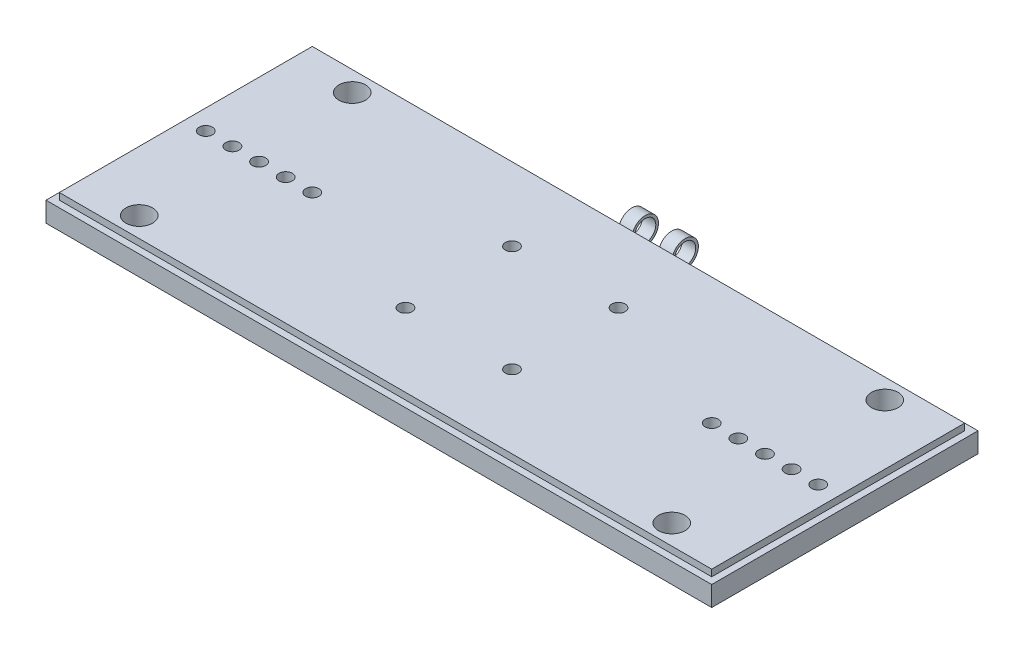
ISO-10303-21;
HEADER;
FILE_DESCRIPTION(('STEP AP214'),'2;1');
FILE_NAME('part.step','',(''),(''),'','','');
FILE_SCHEMA(('AUTOMOTIVE_DESIGN { 1 0 10303 214 1 1 1 1 }'));
ENDSEC;
DATA;
#1=APPLICATION_CONTEXT('core data for automotive mechanical design processes');
#2=APPLICATION_PROTOCOL_DEFINITION('international standard','automotive_design',2000,#1);
#3=PRODUCT_CONTEXT('',#1,'mechanical');
#4=PRODUCT('Part','Part','',(#3));
#5=PRODUCT_RELATED_PRODUCT_CATEGORY('part','',(#4));
#6=PRODUCT_DEFINITION_FORMATION('','',#4);
#7=PRODUCT_DEFINITION_CONTEXT('part definition',#1,'design');
#8=PRODUCT_DEFINITION('design','',#6,#7);
#9=PRODUCT_DEFINITION_SHAPE('','',#8);
#10=(LENGTH_UNIT() NAMED_UNIT(*) SI_UNIT(.MILLI.,.METRE.));
#11=(NAMED_UNIT(*) PLANE_ANGLE_UNIT() SI_UNIT($,.RADIAN.));
#12=(NAMED_UNIT(*) SI_UNIT($,.STERADIAN.) SOLID_ANGLE_UNIT());
#13=UNCERTAINTY_MEASURE_WITH_UNIT(LENGTH_MEASURE(1.E-05),#10,'distance_accuracy_value','');
#14=(GEOMETRIC_REPRESENTATION_CONTEXT(3) GLOBAL_UNCERTAINTY_ASSIGNED_CONTEXT((#13)) GLOBAL_UNIT_ASSIGNED_CONTEXT((#10,
#11,#12)) REPRESENTATION_CONTEXT('',''));
#15=CARTESIAN_POINT('',(0.,0.,0.));
#16=DIRECTION('',(0.,0.,1.));
#17=DIRECTION('',(1.,0.,0.));
#18=AXIS2_PLACEMENT_3D('',#15,#16,#17);
#19=CARTESIAN_POINT('',(10.,0.,-55.));
#20=DIRECTION('',(-1.,0.,0.));
#21=DIRECTION('',(0.,0.,1.));
#22=AXIS2_PLACEMENT_3D('',#19,#20,#21);
#23=CYLINDRICAL_SURFACE('',#22,5.);
#24=CARTESIAN_POINT('',(5.,0.,-55.));
#25=DIRECTION('',(-1.,0.,0.));
#26=DIRECTION('',(0.,0.,1.));
#27=AXIS2_PLACEMENT_3D('',#24,#25,#26);
#28=CIRCLE('',#27,5.);
#29=CARTESIAN_POINT('',(5.,0.,-50.));
#30=VERTEX_POINT('',#29);
#31=CARTESIAN_POINT('',(5.,-5.,-55.));
#32=VERTEX_POINT('',#31);
#33=EDGE_CURVE('E352',#30,#32,#28,.T.);
#34=ORIENTED_EDGE('',*,*,#33,.F.);
#35=DIRECTION('',(-1.,0.,0.));
#36=VECTOR('',#35,1.);
#37=CARTESIAN_POINT('',(10.,0.,-50.));
#38=LINE('',#37,#36);
#39=CARTESIAN_POINT('',(10.,0.,-50.));
#40=VERTEX_POINT('',#39);
#41=EDGE_CURVE('E221',#40,#30,#38,.T.);
#42=ORIENTED_EDGE('',*,*,#41,.F.);
#43=CARTESIAN_POINT('',(10.,0.,-55.));
#44=DIRECTION('',(1.,0.,0.));
#45=DIRECTION('',(0.,0.,-1.));
#46=AXIS2_PLACEMENT_3D('',#43,#44,#45);
#47=CIRCLE('',#46,5.);
#48=CARTESIAN_POINT('',(10.,-5.,-55.));
#49=VERTEX_POINT('',#48);
#50=EDGE_CURVE('E201',#49,#40,#47,.T.);
#51=ORIENTED_EDGE('',*,*,#50,.F.);
#52=DIRECTION('',(-1.,0.,0.));
#53=VECTOR('',#52,1.);
#54=CARTESIAN_POINT('',(10.,-5.,-55.));
#55=LINE('',#54,#53);
#56=EDGE_CURVE('E217',#49,#32,#55,.T.);
#57=ORIENTED_EDGE('',*,*,#56,.T.);
#58=EDGE_LOOP('',(#34,#42,#51,#57));
#59=FACE_BOUND('',#58,.T.);
#60=ADVANCED_FACE('F39',(#59),#23,.T.);
#61=CARTESIAN_POINT('',(0.,5.,0.));
#62=DIRECTION('',(0.,-1.,0.));
#63=DIRECTION('',(0.,0.,-1.));
#64=AXIS2_PLACEMENT_3D('',#61,#62,#63);
#65=PLANE('',#64);
#66=DIRECTION('',(1.,0.,0.));
#67=VECTOR('',#66,1.);
#68=CARTESIAN_POINT('',(0.,5.,47.5));
#69=LINE('',#68,#67);
#70=CARTESIAN_POINT('',(-122.5,5.,47.5));
#71=VERTEX_POINT('',#70);
#72=CARTESIAN_POINT('',(122.5,5.,47.5));
#73=VERTEX_POINT('',#72);
#74=EDGE_CURVE('E154',#71,#73,#69,.T.);
#75=ORIENTED_EDGE('',*,*,#74,.T.);
#76=DIRECTION('',(0.,0.,-1.));
#77=VECTOR('',#76,1.);
#78=CARTESIAN_POINT('',(122.5,5.,0.));
#79=LINE('',#78,#77);
#80=CARTESIAN_POINT('',(122.5,5.,-47.5));
#81=VERTEX_POINT('',#80);
#82=EDGE_CURVE('E155',#73,#81,#79,.T.);
#83=ORIENTED_EDGE('',*,*,#82,.T.);
#84=DIRECTION('',(-1.,0.,0.));
#85=VECTOR('',#84,1.);
#86=CARTESIAN_POINT('',(0.,5.,-47.5));
#87=LINE('',#86,#85);
#88=CARTESIAN_POINT('',(-122.5,5.,-47.5));
#89=VERTEX_POINT('',#88);
#90=EDGE_CURVE('E164',#81,#89,#87,.T.);
#91=ORIENTED_EDGE('',*,*,#90,.T.);
#92=DIRECTION('',(0.,0.,1.));
#93=VECTOR('',#92,1.);
#94=CARTESIAN_POINT('',(-122.5,5.,0.));
#95=LINE('',#94,#93);
#96=EDGE_CURVE('E156',#89,#71,#95,.T.);
#97=ORIENTED_EDGE('',*,*,#96,.T.);
#98=EDGE_LOOP('',(#75,#83,#91,#97));
#99=FACE_BOUND('',#98,.T.);
#100=CARTESIAN_POINT('',(-100.,5.,-40.));
#101=DIRECTION('',(0.,1.,0.));
#102=DIRECTION('',(0.,0.,1.));
#103=AXIS2_PLACEMENT_3D('',#100,#101,#102);
#104=CIRCLE('',#103,5.00000000000001);
#105=CARTESIAN_POINT('',(-100.,5.,-35.));
#106=VERTEX_POINT('',#105);
#107=EDGE_CURVE('E327',#106,#106,#104,.T.);
#108=ORIENTED_EDGE('',*,*,#107,.F.);
#109=EDGE_LOOP('',(#108));
#110=FACE_BOUND('',#109,.T.);
#111=CARTESIAN_POINT('',(100.,5.,-40.));
#112=DIRECTION('',(0.,1.,0.));
#113=DIRECTION('',(0.,0.,1.));
#114=AXIS2_PLACEMENT_3D('',#111,#112,#113);
#115=CIRCLE('',#114,5.00000000000001);
#116=CARTESIAN_POINT('',(100.,5.,-35.));
#117=VERTEX_POINT('',#116);
#118=EDGE_CURVE('E321',#117,#117,#115,.T.);
#119=ORIENTED_EDGE('',*,*,#118,.F.);
#120=EDGE_LOOP('',(#119));
#121=FACE_BOUND('',#120,.T.);
#122=CARTESIAN_POINT('',(-100.,5.,40.));
#123=DIRECTION('',(0.,1.,0.));
#124=DIRECTION('',(0.,0.,-1.));
#125=AXIS2_PLACEMENT_3D('',#122,#123,#124);
#126=CIRCLE('',#125,5.00000000000001);
#127=CARTESIAN_POINT('',(-100.,5.,35.));
#128=VERTEX_POINT('',#127);
#129=EDGE_CURVE('E315',#128,#128,#126,.T.);
#130=ORIENTED_EDGE('',*,*,#129,.F.);
#131=EDGE_LOOP('',(#130));
#132=FACE_BOUND('',#131,.T.);
#133=CARTESIAN_POINT('',(100.,5.,40.));
#134=DIRECTION('',(0.,1.,0.));
#135=DIRECTION('',(0.,0.,-1.));
#136=AXIS2_PLACEMENT_3D('',#133,#134,#135);
#137=CIRCLE('',#136,5.00000000000001);
#138=CARTESIAN_POINT('',(100.,5.,35.));
#139=VERTEX_POINT('',#138);
#140=EDGE_CURVE('E309',#139,#139,#137,.T.);
#141=ORIENTED_EDGE('',*,*,#140,.F.);
#142=EDGE_LOOP('',(#141));
#143=FACE_BOUND('',#142,.T.);
#144=CARTESIAN_POINT('',(-20.,5.,-20.));
#145=DIRECTION('',(0.,1.,0.));
#146=DIRECTION('',(0.,0.,1.));
#147=AXIS2_PLACEMENT_3D('',#144,#145,#146);
#148=CIRCLE('',#147,2.5);
#149=CARTESIAN_POINT('',(-20.,5.,-17.5));
#150=VERTEX_POINT('',#149);
#151=EDGE_CURVE('E303',#150,#150,#148,.T.);
#152=ORIENTED_EDGE('',*,*,#151,.F.);
#153=EDGE_LOOP('',(#152));
#154=FACE_BOUND('',#153,.T.);
#155=CARTESIAN_POINT('',(20.,5.,-20.));
#156=DIRECTION('',(0.,1.,0.));
#157=DIRECTION('',(0.,0.,1.));
#158=AXIS2_PLACEMENT_3D('',#155,#156,#157);
#159=CIRCLE('',#158,2.5);
#160=CARTESIAN_POINT('',(20.,5.,-17.5));
#161=VERTEX_POINT('',#160);
#162=EDGE_CURVE('E297',#161,#161,#159,.T.);
#163=ORIENTED_EDGE('',*,*,#162,.F.);
#164=EDGE_LOOP('',(#163));
#165=FACE_BOUND('',#164,.T.);
#166=CARTESIAN_POINT('',(-20.,5.,20.));
#167=DIRECTION('',(0.,1.,0.));
#168=DIRECTION('',(0.,0.,1.));
#169=AXIS2_PLACEMENT_3D('',#166,#167,#168);
#170=CIRCLE('',#169,2.5);
#171=CARTESIAN_POINT('',(-20.,5.,22.5));
#172=VERTEX_POINT('',#171);
#173=EDGE_CURVE('E291',#172,#172,#170,.T.);
#174=ORIENTED_EDGE('',*,*,#173,.F.);
#175=EDGE_LOOP('',(#174));
#176=FACE_BOUND('',#175,.T.);
#177=CARTESIAN_POINT('',(20.,5.,20.));
#178=DIRECTION('',(0.,1.,0.));
#179=DIRECTION('',(0.,0.,1.));
#180=AXIS2_PLACEMENT_3D('',#177,#178,#179);
#181=CIRCLE('',#180,2.5);
#182=CARTESIAN_POINT('',(20.,5.,22.5));
#183=VERTEX_POINT('',#182);
#184=EDGE_CURVE('E285',#183,#183,#181,.T.);
#185=ORIENTED_EDGE('',*,*,#184,.F.);
#186=EDGE_LOOP('',(#185));
#187=FACE_BOUND('',#186,.T.);
#188=CARTESIAN_POINT('',(-115.,5.,0.));
#189=DIRECTION('',(0.,1.,0.));
#190=DIRECTION('',(0.,0.,1.));
#191=AXIS2_PLACEMENT_3D('',#188,#189,#190);
#192=CIRCLE('',#191,2.49999999999999);
#193=CARTESIAN_POINT('',(-115.,5.,2.49999999999999));
#194=VERTEX_POINT('',#193);
#195=EDGE_CURVE('E279',#194,#194,#192,.T.);
#196=ORIENTED_EDGE('',*,*,#195,.F.);
#197=EDGE_LOOP('',(#196));
#198=FACE_BOUND('',#197,.T.);
#199=CARTESIAN_POINT('',(-105.,5.,0.));
#200=DIRECTION('',(0.,1.,0.));
#201=DIRECTION('',(0.,0.,1.));
#202=AXIS2_PLACEMENT_3D('',#199,#200,#201);
#203=CIRCLE('',#202,2.49999999999999);
#204=CARTESIAN_POINT('',(-105.,5.,2.49999999999999));
#205=VERTEX_POINT('',#204);
#206=EDGE_CURVE('E273',#205,#205,#203,.T.);
#207=ORIENTED_EDGE('',*,*,#206,.F.);
#208=EDGE_LOOP('',(#207));
#209=FACE_BOUND('',#208,.T.);
#210=CARTESIAN_POINT('',(-95.,5.,0.));
#211=DIRECTION('',(0.,1.,0.));
#212=DIRECTION('',(0.,0.,1.));
#213=AXIS2_PLACEMENT_3D('',#210,#211,#212);
#214=CIRCLE('',#213,2.49999999999999);
#215=CARTESIAN_POINT('',(-95.,5.,2.49999999999999));
#216=VERTEX_POINT('',#215);
#217=EDGE_CURVE('E267',#216,#216,#214,.T.);
#218=ORIENTED_EDGE('',*,*,#217,.F.);
#219=EDGE_LOOP('',(#218));
#220=FACE_BOUND('',#219,.T.);
#221=CARTESIAN_POINT('',(-85.,5.,0.));
#222=DIRECTION('',(0.,1.,0.));
#223=DIRECTION('',(0.,0.,1.));
#224=AXIS2_PLACEMENT_3D('',#221,#222,#223);
#225=CIRCLE('',#224,2.49999999999999);
#226=CARTESIAN_POINT('',(-85.,5.,2.49999999999999));
#227=VERTEX_POINT('',#226);
#228=EDGE_CURVE('E261',#227,#227,#225,.T.);
#229=ORIENTED_EDGE('',*,*,#228,.F.);
#230=EDGE_LOOP('',(#229));
#231=FACE_BOUND('',#230,.T.);
#232=CARTESIAN_POINT('',(-75.,5.,0.));
#233=DIRECTION('',(0.,1.,0.));
#234=DIRECTION('',(0.,0.,1.));
#235=AXIS2_PLACEMENT_3D('',#232,#233,#234);
#236=CIRCLE('',#235,2.49999999999999);
#237=CARTESIAN_POINT('',(-75.,5.,2.49999999999999));
#238=VERTEX_POINT('',#237);
#239=EDGE_CURVE('E255',#238,#238,#236,.T.);
#240=ORIENTED_EDGE('',*,*,#239,.F.);
#241=EDGE_LOOP('',(#240));
#242=FACE_BOUND('',#241,.T.);
#243=CARTESIAN_POINT('',(75.,5.,0.));
#244=DIRECTION('',(0.,1.,0.));
#245=DIRECTION('',(0.,0.,-1.));
#246=AXIS2_PLACEMENT_3D('',#243,#244,#245);
#247=CIRCLE('',#246,2.49999999999999);
#248=CARTESIAN_POINT('',(75.,5.,-2.49999999999999));
#249=VERTEX_POINT('',#248);
#250=EDGE_CURVE('E249',#249,#249,#247,.T.);
#251=ORIENTED_EDGE('',*,*,#250,.F.);
#252=EDGE_LOOP('',(#251));
#253=FACE_BOUND('',#252,.T.);
#254=CARTESIAN_POINT('',(85.,5.,0.));
#255=DIRECTION('',(0.,1.,0.));
#256=DIRECTION('',(0.,0.,-1.));
#257=AXIS2_PLACEMENT_3D('',#254,#255,#256);
#258=CIRCLE('',#257,2.49999999999999);
#259=CARTESIAN_POINT('',(85.,5.,-2.49999999999999));
#260=VERTEX_POINT('',#259);
#261=EDGE_CURVE('E243',#260,#260,#258,.T.);
#262=ORIENTED_EDGE('',*,*,#261,.F.);
#263=EDGE_LOOP('',(#262));
#264=FACE_BOUND('',#263,.T.);
#265=CARTESIAN_POINT('',(95.,5.,0.));
#266=DIRECTION('',(0.,1.,0.));
#267=DIRECTION('',(0.,0.,-1.));
#268=AXIS2_PLACEMENT_3D('',#265,#266,#267);
#269=CIRCLE('',#268,2.49999999999999);
#270=CARTESIAN_POINT('',(95.,5.,-2.49999999999999));
#271=VERTEX_POINT('',#270);
#272=EDGE_CURVE('E237',#271,#271,#269,.T.);
#273=ORIENTED_EDGE('',*,*,#272,.F.);
#274=EDGE_LOOP('',(#273));
#275=FACE_BOUND('',#274,.T.);
#276=CARTESIAN_POINT('',(105.,5.,0.));
#277=DIRECTION('',(0.,1.,0.));
#278=DIRECTION('',(0.,0.,-1.));
#279=AXIS2_PLACEMENT_3D('',#276,#277,#278);
#280=CIRCLE('',#279,2.49999999999999);
#281=CARTESIAN_POINT('',(105.,5.,-2.49999999999999));
#282=VERTEX_POINT('',#281);
#283=EDGE_CURVE('E231',#282,#282,#280,.T.);
#284=ORIENTED_EDGE('',*,*,#283,.F.);
#285=EDGE_LOOP('',(#284));
#286=FACE_BOUND('',#285,.T.);
#287=CARTESIAN_POINT('',(115.,5.,0.));
#288=DIRECTION('',(0.,1.,0.));
#289=DIRECTION('',(0.,0.,-1.));
#290=AXIS2_PLACEMENT_3D('',#287,#288,#289);
#291=CIRCLE('',#290,2.49999999999999);
#292=CARTESIAN_POINT('',(115.,5.,-2.49999999999999));
#293=VERTEX_POINT('',#292);
#294=EDGE_CURVE('E225',#293,#293,#291,.T.);
#295=ORIENTED_EDGE('',*,*,#294,.F.);
#296=EDGE_LOOP('',(#295));
#297=FACE_BOUND('',#296,.T.);
#298=ADVANCED_FACE('F366',(#99,#110,#121,#132,#143,#154,#165,#176,#187,#198,#209,#220,#231,#242,
#253,#264,#275,#286,#297),#65,.F.);
#299=CARTESIAN_POINT('',(0.,-5.,0.));
#300=DIRECTION('',(0.,-1.,0.));
#301=DIRECTION('',(0.,0.,-1.));
#302=AXIS2_PLACEMENT_3D('',#299,#300,#301);
#303=PLANE('',#302);
#304=DIRECTION('',(0.,0.,-1.));
#305=VECTOR('',#304,1.);
#306=CARTESIAN_POINT('',(-5.,-5.,0.));
#307=LINE('',#306,#305);
#308=CARTESIAN_POINT('',(-5.,-5.,-50.));
#309=VERTEX_POINT('',#308);
#310=CARTESIAN_POINT('',(-5.,-5.,-55.));
#311=VERTEX_POINT('',#310);
#312=EDGE_CURVE('E196',#309,#311,#307,.T.);
#313=ORIENTED_EDGE('',*,*,#312,.F.);
#314=DIRECTION('',(-1.,0.,0.));
#315=VECTOR('',#314,1.);
#316=CARTESIAN_POINT('',(0.,-5.,-50.));
#317=LINE('',#316,#315);
#318=CARTESIAN_POINT('',(5.,-5.,-50.));
#319=VERTEX_POINT('',#318);
#320=EDGE_CURVE('E198',#319,#309,#317,.T.);
#321=ORIENTED_EDGE('',*,*,#320,.F.);
#322=DIRECTION('',(0.,0.,-1.));
#323=VECTOR('',#322,1.);
#324=CARTESIAN_POINT('',(5.,-5.,0.));
#325=LINE('',#324,#323);
#326=EDGE_CURVE('E191',#319,#32,#325,.T.);
#327=ORIENTED_EDGE('',*,*,#326,.T.);
#328=ORIENTED_EDGE('',*,*,#56,.F.);
#329=DIRECTION('',(0.,0.,-1.));
#330=VECTOR('',#329,1.);
#331=CARTESIAN_POINT('',(10.,-5.,-55.));
#332=LINE('',#331,#330);
#333=CARTESIAN_POINT('',(10.,-5.,-50.));
#334=VERTEX_POINT('',#333);
#335=EDGE_CURVE('E208',#334,#49,#332,.T.);
#336=ORIENTED_EDGE('',*,*,#335,.F.);
#337=DIRECTION('',(-1.,0.,0.));
#338=VECTOR('',#337,1.);
#339=CARTESIAN_POINT('',(-125.,-5.,-50.));
#340=LINE('',#339,#338);
#341=CARTESIAN_POINT('',(125.,-5.,-50.));
#342=VERTEX_POINT('',#341);
#343=EDGE_CURVE('E336',#342,#334,#340,.T.);
#344=ORIENTED_EDGE('',*,*,#343,.F.);
#345=DIRECTION('',(0.,0.,-1.));
#346=VECTOR('',#345,1.);
#347=CARTESIAN_POINT('',(125.,-5.,50.));
#348=LINE('',#347,#346);
#349=CARTESIAN_POINT('',(125.,-5.,50.));
#350=VERTEX_POINT('',#349);
#351=EDGE_CURVE('E330',#350,#342,#348,.T.);
#352=ORIENTED_EDGE('',*,*,#351,.F.);
#353=DIRECTION('',(1.,0.,0.));
#354=VECTOR('',#353,1.);
#355=CARTESIAN_POINT('',(-125.,-5.,50.));
#356=LINE('',#355,#354);
#357=CARTESIAN_POINT('',(-125.,-5.,50.));
#358=VERTEX_POINT('',#357);
#359=EDGE_CURVE('E341',#358,#350,#356,.T.);
#360=ORIENTED_EDGE('',*,*,#359,.F.);
#361=DIRECTION('',(0.,0.,1.));
#362=VECTOR('',#361,1.);
#363=CARTESIAN_POINT('',(-125.,-5.,50.));
#364=LINE('',#363,#362);
#365=CARTESIAN_POINT('',(-125.,-5.,-50.));
#366=VERTEX_POINT('',#365);
#367=EDGE_CURVE('E338',#366,#358,#364,.T.);
#368=ORIENTED_EDGE('',*,*,#367,.F.);
#369=CARTESIAN_POINT('',(-9.99999999999999,-5.,-50.));
#370=VERTEX_POINT('',#369);
#371=EDGE_CURVE('E335',#370,#366,#340,.T.);
#372=ORIENTED_EDGE('',*,*,#371,.F.);
#373=DIRECTION('',(0.,0.,-1.));
#374=VECTOR('',#373,1.);
#375=CARTESIAN_POINT('',(-10.,-5.,-55.));
#376=LINE('',#375,#374);
#377=CARTESIAN_POINT('',(-10.,-5.,-55.));
#378=VERTEX_POINT('',#377);
#379=EDGE_CURVE('E205',#370,#378,#376,.T.);
#380=ORIENTED_EDGE('',*,*,#379,.T.);
#381=EDGE_CURVE('E210',#311,#378,#55,.T.);
#382=ORIENTED_EDGE('',*,*,#381,.F.);
#383=EDGE_LOOP('',(#313,#321,#327,#328,#336,#344,#352,#360,#368,#372,#380,#382));
#384=FACE_BOUND('',#383,.T.);
#385=CARTESIAN_POINT('',(105.,-5.,0.));
#386=DIRECTION('',(0.,1.,0.));
#387=DIRECTION('',(0.,0.,-1.));
#388=AXIS2_PLACEMENT_3D('',#385,#386,#387);
#389=CIRCLE('',#388,2.49999999999999);
#390=CARTESIAN_POINT('',(105.,-5.,-2.49999999999999));
#391=VERTEX_POINT('',#390);
#392=EDGE_CURVE('E228',#391,#391,#389,.T.);
#393=ORIENTED_EDGE('',*,*,#392,.T.);
#394=EDGE_LOOP('',(#393));
#395=FACE_BOUND('',#394,.T.);
#396=CARTESIAN_POINT('',(85.,-5.,0.));
#397=DIRECTION('',(0.,1.,0.));
#398=DIRECTION('',(0.,0.,-1.));
#399=AXIS2_PLACEMENT_3D('',#396,#397,#398);
#400=CIRCLE('',#399,2.49999999999999);
#401=CARTESIAN_POINT('',(85.,-5.,-2.49999999999999));
#402=VERTEX_POINT('',#401);
#403=EDGE_CURVE('E240',#402,#402,#400,.T.);
#404=ORIENTED_EDGE('',*,*,#403,.T.);
#405=EDGE_LOOP('',(#404));
#406=FACE_BOUND('',#405,.T.);
#407=CARTESIAN_POINT('',(-75.,-5.,0.));
#408=DIRECTION('',(0.,1.,0.));
#409=DIRECTION('',(0.,0.,1.));
#410=AXIS2_PLACEMENT_3D('',#407,#408,#409);
#411=CIRCLE('',#410,2.49999999999999);
#412=CARTESIAN_POINT('',(-75.,-5.,2.49999999999999));
#413=VERTEX_POINT('',#412);
#414=EDGE_CURVE('E252',#413,#413,#411,.T.);
#415=ORIENTED_EDGE('',*,*,#414,.T.);
#416=EDGE_LOOP('',(#415));
#417=FACE_BOUND('',#416,.T.);
#418=CARTESIAN_POINT('',(-95.,-5.,0.));
#419=DIRECTION('',(0.,1.,0.));
#420=DIRECTION('',(0.,0.,1.));
#421=AXIS2_PLACEMENT_3D('',#418,#419,#420);
#422=CIRCLE('',#421,2.49999999999999);
#423=CARTESIAN_POINT('',(-95.,-5.,2.49999999999999));
#424=VERTEX_POINT('',#423);
#425=EDGE_CURVE('E264',#424,#424,#422,.T.);
#426=ORIENTED_EDGE('',*,*,#425,.T.);
#427=EDGE_LOOP('',(#426));
#428=FACE_BOUND('',#427,.T.);
#429=CARTESIAN_POINT('',(-115.,-5.,0.));
#430=DIRECTION('',(0.,1.,0.));
#431=DIRECTION('',(0.,0.,1.));
#432=AXIS2_PLACEMENT_3D('',#429,#430,#431);
#433=CIRCLE('',#432,2.49999999999999);
#434=CARTESIAN_POINT('',(-115.,-5.,2.49999999999999));
#435=VERTEX_POINT('',#434);
#436=EDGE_CURVE('E276',#435,#435,#433,.T.);
#437=ORIENTED_EDGE('',*,*,#436,.T.);
#438=EDGE_LOOP('',(#437));
#439=FACE_BOUND('',#438,.T.);
#440=CARTESIAN_POINT('',(-20.,-5.,20.));
#441=DIRECTION('',(0.,1.,0.));
#442=DIRECTION('',(0.,0.,1.));
#443=AXIS2_PLACEMENT_3D('',#440,#441,#442);
#444=CIRCLE('',#443,2.5);
#445=CARTESIAN_POINT('',(-20.,-5.,22.5));
#446=VERTEX_POINT('',#445);
#447=EDGE_CURVE('E288',#446,#446,#444,.T.);
#448=ORIENTED_EDGE('',*,*,#447,.T.);
#449=EDGE_LOOP('',(#448));
#450=FACE_BOUND('',#449,.T.);
#451=CARTESIAN_POINT('',(-20.,-5.,-20.));
#452=DIRECTION('',(0.,1.,0.));
#453=DIRECTION('',(0.,0.,1.));
#454=AXIS2_PLACEMENT_3D('',#451,#452,#453);
#455=CIRCLE('',#454,2.5);
#456=CARTESIAN_POINT('',(-20.,-5.,-17.5));
#457=VERTEX_POINT('',#456);
#458=EDGE_CURVE('E300',#457,#457,#455,.T.);
#459=ORIENTED_EDGE('',*,*,#458,.T.);
#460=EDGE_LOOP('',(#459));
#461=FACE_BOUND('',#460,.T.);
#462=CARTESIAN_POINT('',(-100.,-5.,40.));
#463=DIRECTION('',(0.,1.,0.));
#464=DIRECTION('',(0.,0.,-1.));
#465=AXIS2_PLACEMENT_3D('',#462,#463,#464);
#466=CIRCLE('',#465,5.00000000000001);
#467=CARTESIAN_POINT('',(-100.,-5.,35.));
#468=VERTEX_POINT('',#467);
#469=EDGE_CURVE('E312',#468,#468,#466,.T.);
#470=ORIENTED_EDGE('',*,*,#469,.T.);
#471=EDGE_LOOP('',(#470));
#472=FACE_BOUND('',#471,.T.);
#473=CARTESIAN_POINT('',(-100.,-5.,-40.));
#474=DIRECTION('',(0.,1.,0.));
#475=DIRECTION('',(0.,0.,1.));
#476=AXIS2_PLACEMENT_3D('',#473,#474,#475);
#477=CIRCLE('',#476,5.00000000000001);
#478=CARTESIAN_POINT('',(-100.,-5.,-35.));
#479=VERTEX_POINT('',#478);
#480=EDGE_CURVE('E324',#479,#479,#477,.T.);
#481=ORIENTED_EDGE('',*,*,#480,.T.);
#482=EDGE_LOOP('',(#481));
#483=FACE_BOUND('',#482,.T.);
#484=CARTESIAN_POINT('',(100.,-5.,-40.));
#485=DIRECTION('',(0.,1.,0.));
#486=DIRECTION('',(0.,0.,1.));
#487=AXIS2_PLACEMENT_3D('',#484,#485,#486);
#488=CIRCLE('',#487,5.00000000000001);
#489=CARTESIAN_POINT('',(100.,-5.,-35.));
#490=VERTEX_POINT('',#489);
#491=EDGE_CURVE('E318',#490,#490,#488,.T.);
#492=ORIENTED_EDGE('',*,*,#491,.T.);
#493=EDGE_LOOP('',(#492));
#494=FACE_BOUND('',#493,.T.);
#495=CARTESIAN_POINT('',(100.,-5.,40.));
#496=DIRECTION('',(0.,1.,0.));
#497=DIRECTION('',(0.,0.,-1.));
#498=AXIS2_PLACEMENT_3D('',#495,#496,#497);
#499=CIRCLE('',#498,5.00000000000001);
#500=CARTESIAN_POINT('',(100.,-5.,35.));
#501=VERTEX_POINT('',#500);
#502=EDGE_CURVE('E306',#501,#501,#499,.T.);
#503=ORIENTED_EDGE('',*,*,#502,.T.);
#504=EDGE_LOOP('',(#503));
#505=FACE_BOUND('',#504,.T.);
#506=CARTESIAN_POINT('',(20.,-5.,-20.));
#507=DIRECTION('',(0.,1.,0.));
#508=DIRECTION('',(0.,0.,1.));
#509=AXIS2_PLACEMENT_3D('',#506,#507,#508);
#510=CIRCLE('',#509,2.5);
#511=CARTESIAN_POINT('',(20.,-5.,-17.5));
#512=VERTEX_POINT('',#511);
#513=EDGE_CURVE('E294',#512,#512,#510,.T.);
#514=ORIENTED_EDGE('',*,*,#513,.T.);
#515=EDGE_LOOP('',(#514));
#516=FACE_BOUND('',#515,.T.);
#517=CARTESIAN_POINT('',(20.,-5.,20.));
#518=DIRECTION('',(0.,1.,0.));
#519=DIRECTION('',(0.,0.,1.));
#520=AXIS2_PLACEMENT_3D('',#517,#518,#519);
#521=CIRCLE('',#520,2.5);
#522=CARTESIAN_POINT('',(20.,-5.,22.5));
#523=VERTEX_POINT('',#522);
#524=EDGE_CURVE('E282',#523,#523,#521,.T.);
#525=ORIENTED_EDGE('',*,*,#524,.T.);
#526=EDGE_LOOP('',(#525));
#527=FACE_BOUND('',#526,.T.);
#528=CARTESIAN_POINT('',(-105.,-5.,0.));
#529=DIRECTION('',(0.,1.,0.));
#530=DIRECTION('',(0.,0.,1.));
#531=AXIS2_PLACEMENT_3D('',#528,#529,#530);
#532=CIRCLE('',#531,2.49999999999999);
#533=CARTESIAN_POINT('',(-105.,-5.,2.49999999999999));
#534=VERTEX_POINT('',#533);
#535=EDGE_CURVE('E270',#534,#534,#532,.T.);
#536=ORIENTED_EDGE('',*,*,#535,.T.);
#537=EDGE_LOOP('',(#536));
#538=FACE_BOUND('',#537,.T.);
#539=CARTESIAN_POINT('',(-85.,-5.,0.));
#540=DIRECTION('',(0.,1.,0.));
#541=DIRECTION('',(0.,0.,1.));
#542=AXIS2_PLACEMENT_3D('',#539,#540,#541);
#543=CIRCLE('',#542,2.49999999999999);
#544=CARTESIAN_POINT('',(-85.,-5.,2.49999999999999));
#545=VERTEX_POINT('',#544);
#546=EDGE_CURVE('E258',#545,#545,#543,.T.);
#547=ORIENTED_EDGE('',*,*,#546,.T.);
#548=EDGE_LOOP('',(#547));
#549=FACE_BOUND('',#548,.T.);
#550=CARTESIAN_POINT('',(75.,-5.,0.));
#551=DIRECTION('',(0.,1.,0.));
#552=DIRECTION('',(0.,0.,-1.));
#553=AXIS2_PLACEMENT_3D('',#550,#551,#552);
#554=CIRCLE('',#553,2.49999999999999);
#555=CARTESIAN_POINT('',(75.,-5.,-2.49999999999999));
#556=VERTEX_POINT('',#555);
#557=EDGE_CURVE('E246',#556,#556,#554,.T.);
#558=ORIENTED_EDGE('',*,*,#557,.T.);
#559=EDGE_LOOP('',(#558));
#560=FACE_BOUND('',#559,.T.);
#561=CARTESIAN_POINT('',(95.,-5.,0.));
#562=DIRECTION('',(0.,1.,0.));
#563=DIRECTION('',(0.,0.,-1.));
#564=AXIS2_PLACEMENT_3D('',#561,#562,#563);
#565=CIRCLE('',#564,2.49999999999999);
#566=CARTESIAN_POINT('',(95.,-5.,-2.49999999999999));
#567=VERTEX_POINT('',#566);
#568=EDGE_CURVE('E234',#567,#567,#565,.T.);
#569=ORIENTED_EDGE('',*,*,#568,.T.);
#570=EDGE_LOOP('',(#569));
#571=FACE_BOUND('',#570,.T.);
#572=CARTESIAN_POINT('',(115.,-5.,0.));
#573=DIRECTION('',(0.,1.,0.));
#574=DIRECTION('',(0.,0.,-1.));
#575=AXIS2_PLACEMENT_3D('',#572,#573,#574);
#576=CIRCLE('',#575,2.49999999999999);
#577=CARTESIAN_POINT('',(115.,-5.,-2.49999999999999));
#578=VERTEX_POINT('',#577);
#579=EDGE_CURVE('E224',#578,#578,#576,.T.);
#580=ORIENTED_EDGE('',*,*,#579,.T.);
#581=EDGE_LOOP('',(#580));
#582=FACE_BOUND('',#581,.T.);
#583=ADVANCED_FACE('F385',(#384,#395,#406,#417,#428,#439,#450,#461,#472,#483,#494,#505,#516,
#527,#538,#549,#560,#571,#582),#303,.T.);
#584=CARTESIAN_POINT('',(125.,5.,50.));
#585=DIRECTION('',(-1.,0.,0.));
#586=DIRECTION('',(0.,0.,1.));
#587=AXIS2_PLACEMENT_3D('',#584,#585,#586);
#588=PLANE('',#587);
#589=DIRECTION('',(0.,-1.,0.));
#590=VECTOR('',#589,1.);
#591=CARTESIAN_POINT('',(125.,5.,-50.));
#592=LINE('',#591,#590);
#593=CARTESIAN_POINT('',(125.,2.5,-50.));
#594=VERTEX_POINT('',#593);
#595=EDGE_CURVE('E350',#594,#342,#592,.T.);
#596=ORIENTED_EDGE('',*,*,#595,.F.);
#597=DIRECTION('',(0.,0.,1.));
#598=VECTOR('',#597,1.);
#599=CARTESIAN_POINT('',(125.,2.5,50.));
#600=LINE('',#599,#598);
#601=CARTESIAN_POINT('',(125.,2.5,50.));
#602=VERTEX_POINT('',#601);
#603=EDGE_CURVE('E160',#594,#602,#600,.T.);
#604=ORIENTED_EDGE('',*,*,#603,.T.);
#605=DIRECTION('',(0.,-1.,0.));
#606=VECTOR('',#605,1.);
#607=CARTESIAN_POINT('',(125.,5.,50.));
#608=LINE('',#607,#606);
#609=EDGE_CURVE('E344',#602,#350,#608,.T.);
#610=ORIENTED_EDGE('',*,*,#609,.T.);
#611=ORIENTED_EDGE('',*,*,#351,.T.);
#612=EDGE_LOOP('',(#596,#604,#610,#611));
#613=FACE_BOUND('',#612,.T.);
#614=ADVANCED_FACE('F41',(#613),#588,.F.);
#615=CARTESIAN_POINT('',(-125.,5.,-50.));
#616=DIRECTION('',(0.,0.,1.));
#617=DIRECTION('',(1.,0.,0.));
#618=AXIS2_PLACEMENT_3D('',#615,#616,#617);
#619=PLANE('',#618);
#620=DIRECTION('',(0.,-1.,0.));
#621=VECTOR('',#620,1.);
#622=CARTESIAN_POINT('',(-125.,5.,-50.));
#623=LINE('',#622,#621);
#624=CARTESIAN_POINT('',(-125.,2.5,-50.));
#625=VERTEX_POINT('',#624);
#626=EDGE_CURVE('E348',#625,#366,#623,.T.);
#627=ORIENTED_EDGE('',*,*,#626,.F.);
#628=DIRECTION('',(1.,0.,0.));
#629=VECTOR('',#628,1.);
#630=CARTESIAN_POINT('',(-165.5,2.5,-50.));
#631=LINE('',#630,#629);
#632=EDGE_CURVE('E166',#625,#594,#631,.T.);
#633=ORIENTED_EDGE('',*,*,#632,.T.);
#634=ORIENTED_EDGE('',*,*,#595,.T.);
#635=ORIENTED_EDGE('',*,*,#343,.T.);
#636=DIRECTION('',(0.,-1.,0.));
#637=VECTOR('',#636,1.);
#638=CARTESIAN_POINT('',(10.,-5.,-50.));
#639=LINE('',#638,#637);
#640=EDGE_CURVE('E204',#40,#334,#639,.T.);
#641=ORIENTED_EDGE('',*,*,#640,.F.);
#642=ORIENTED_EDGE('',*,*,#41,.T.);
#643=DIRECTION('',(0.,-1.,0.));
#644=VECTOR('',#643,1.);
#645=CARTESIAN_POINT('',(5.,5.,-50.));
#646=LINE('',#645,#644);
#647=EDGE_CURVE('E187',#30,#319,#646,.T.);
#648=ORIENTED_EDGE('',*,*,#647,.T.);
#649=ORIENTED_EDGE('',*,*,#320,.T.);
#650=DIRECTION('',(0.,-1.,0.));
#651=VECTOR('',#650,1.);
#652=CARTESIAN_POINT('',(-5.,5.,-50.));
#653=LINE('',#652,#651);
#654=CARTESIAN_POINT('',(-5.,0.,-50.));
#655=VERTEX_POINT('',#654);
#656=EDGE_CURVE('E188',#655,#309,#653,.T.);
#657=ORIENTED_EDGE('',*,*,#656,.F.);
#658=CARTESIAN_POINT('',(-10.,0.,-50.));
#659=VERTEX_POINT('',#658);
#660=EDGE_CURVE('E220',#655,#659,#38,.T.);
#661=ORIENTED_EDGE('',*,*,#660,.T.);
#662=DIRECTION('',(0.,-1.,0.));
#663=VECTOR('',#662,1.);
#664=CARTESIAN_POINT('',(-10.,-5.,-50.));
#665=LINE('',#664,#663);
#666=EDGE_CURVE('E213',#659,#370,#665,.T.);
#667=ORIENTED_EDGE('',*,*,#666,.T.);
#668=ORIENTED_EDGE('',*,*,#371,.T.);
#669=EDGE_LOOP('',(#627,#633,#634,#635,#641,#642,#648,#649,#657,#661,#667,#668));
#670=FACE_BOUND('',#669,.T.);
#671=ADVANCED_FACE('F410',(#670),#619,.F.);
#672=CARTESIAN_POINT('',(-125.,5.,50.));
#673=DIRECTION('',(1.,0.,0.));
#674=DIRECTION('',(0.,0.,-1.));
#675=AXIS2_PLACEMENT_3D('',#672,#673,#674);
#676=PLANE('',#675);
#677=DIRECTION('',(0.,-1.,0.));
#678=VECTOR('',#677,1.);
#679=CARTESIAN_POINT('',(-125.,5.,50.));
#680=LINE('',#679,#678);
#681=CARTESIAN_POINT('',(-125.,2.5,50.));
#682=VERTEX_POINT('',#681);
#683=EDGE_CURVE('E346',#682,#358,#680,.T.);
#684=ORIENTED_EDGE('',*,*,#683,.F.);
#685=DIRECTION('',(0.,0.,-1.));
#686=VECTOR('',#685,1.);
#687=CARTESIAN_POINT('',(-125.,2.49999999999998,50.));
#688=LINE('',#687,#686);
#689=EDGE_CURVE('E62',#682,#625,#688,.T.);
#690=ORIENTED_EDGE('',*,*,#689,.T.);
#691=ORIENTED_EDGE('',*,*,#626,.T.);
#692=ORIENTED_EDGE('',*,*,#367,.T.);
#693=EDGE_LOOP('',(#684,#690,#691,#692));
#694=FACE_BOUND('',#693,.T.);
#695=ADVANCED_FACE('F423',(#694),#676,.F.);
#696=CARTESIAN_POINT('',(-125.,5.,50.));
#697=DIRECTION('',(0.,0.,-1.));
#698=DIRECTION('',(-1.,0.,0.));
#699=AXIS2_PLACEMENT_3D('',#696,#697,#698);
#700=PLANE('',#699);
#701=ORIENTED_EDGE('',*,*,#609,.F.);
#702=DIRECTION('',(-1.,0.,0.));
#703=VECTOR('',#702,1.);
#704=CARTESIAN_POINT('',(-125.,2.5,50.));
#705=LINE('',#704,#703);
#706=EDGE_CURVE('E357',#602,#682,#705,.T.);
#707=ORIENTED_EDGE('',*,*,#706,.T.);
#708=ORIENTED_EDGE('',*,*,#683,.T.);
#709=ORIENTED_EDGE('',*,*,#359,.T.);
#710=EDGE_LOOP('',(#701,#707,#708,#709));
#711=FACE_BOUND('',#710,.T.);
#712=ADVANCED_FACE('F426',(#711),#700,.F.);
#713=CARTESIAN_POINT('',(-100.,5.,-40.));
#714=DIRECTION('',(0.,-1.,0.));
#715=DIRECTION('',(0.,0.,-1.));
#716=AXIS2_PLACEMENT_3D('',#713,#714,#715);
#717=CYLINDRICAL_SURFACE('',#716,5.00000000000001);
#718=ORIENTED_EDGE('',*,*,#107,.T.);
#719=EDGE_LOOP('',(#718));
#720=FACE_BOUND('',#719,.T.);
#721=ORIENTED_EDGE('',*,*,#480,.F.);
#722=EDGE_LOOP('',(#721));
#723=FACE_BOUND('',#722,.T.);
#724=ADVANCED_FACE('F712',(#720,#723),#717,.F.);
#725=CARTESIAN_POINT('',(100.,5.,-40.));
#726=DIRECTION('',(0.,-1.,0.));
#727=DIRECTION('',(0.,0.,-1.));
#728=AXIS2_PLACEMENT_3D('',#725,#726,#727);
#729=CYLINDRICAL_SURFACE('',#728,5.00000000000001);
#730=ORIENTED_EDGE('',*,*,#118,.T.);
#731=EDGE_LOOP('',(#730));
#732=FACE_BOUND('',#731,.T.);
#733=ORIENTED_EDGE('',*,*,#491,.F.);
#734=EDGE_LOOP('',(#733));
#735=FACE_BOUND('',#734,.T.);
#736=ADVANCED_FACE('F702',(#732,#735),#729,.F.);
#737=CARTESIAN_POINT('',(-100.,5.,40.));
#738=DIRECTION('',(0.,-1.,0.));
#739=DIRECTION('',(0.,0.,-1.));
#740=AXIS2_PLACEMENT_3D('',#737,#738,#739);
#741=CYLINDRICAL_SURFACE('',#740,5.00000000000001);
#742=ORIENTED_EDGE('',*,*,#129,.T.);
#743=EDGE_LOOP('',(#742));
#744=FACE_BOUND('',#743,.T.);
#745=ORIENTED_EDGE('',*,*,#469,.F.);
#746=EDGE_LOOP('',(#745));
#747=FACE_BOUND('',#746,.T.);
#748=ADVANCED_FACE('F692',(#744,#747),#741,.F.);
#749=CARTESIAN_POINT('',(100.,5.,40.));
#750=DIRECTION('',(0.,-1.,0.));
#751=DIRECTION('',(0.,0.,-1.));
#752=AXIS2_PLACEMENT_3D('',#749,#750,#751);
#753=CYLINDRICAL_SURFACE('',#752,5.00000000000001);
#754=ORIENTED_EDGE('',*,*,#140,.T.);
#755=EDGE_LOOP('',(#754));
#756=FACE_BOUND('',#755,.T.);
#757=ORIENTED_EDGE('',*,*,#502,.F.);
#758=EDGE_LOOP('',(#757));
#759=FACE_BOUND('',#758,.T.);
#760=ADVANCED_FACE('F682',(#756,#759),#753,.F.);
#761=CARTESIAN_POINT('',(-20.,5.,-20.));
#762=DIRECTION('',(0.,-1.,0.));
#763=DIRECTION('',(0.,0.,-1.));
#764=AXIS2_PLACEMENT_3D('',#761,#762,#763);
#765=CYLINDRICAL_SURFACE('',#764,2.5);
#766=ORIENTED_EDGE('',*,*,#151,.T.);
#767=EDGE_LOOP('',(#766));
#768=FACE_BOUND('',#767,.T.);
#769=ORIENTED_EDGE('',*,*,#458,.F.);
#770=EDGE_LOOP('',(#769));
#771=FACE_BOUND('',#770,.T.);
#772=ADVANCED_FACE('F672',(#768,#771),#765,.F.);
#773=CARTESIAN_POINT('',(20.,5.,-20.));
#774=DIRECTION('',(0.,-1.,0.));
#775=DIRECTION('',(0.,0.,-1.));
#776=AXIS2_PLACEMENT_3D('',#773,#774,#775);
#777=CYLINDRICAL_SURFACE('',#776,2.5);
#778=ORIENTED_EDGE('',*,*,#162,.T.);
#779=EDGE_LOOP('',(#778));
#780=FACE_BOUND('',#779,.T.);
#781=ORIENTED_EDGE('',*,*,#513,.F.);
#782=EDGE_LOOP('',(#781));
#783=FACE_BOUND('',#782,.T.);
#784=ADVANCED_FACE('F662',(#780,#783),#777,.F.);
#785=CARTESIAN_POINT('',(-20.,5.,20.));
#786=DIRECTION('',(0.,-1.,0.));
#787=DIRECTION('',(0.,0.,-1.));
#788=AXIS2_PLACEMENT_3D('',#785,#786,#787);
#789=CYLINDRICAL_SURFACE('',#788,2.5);
#790=ORIENTED_EDGE('',*,*,#173,.T.);
#791=EDGE_LOOP('',(#790));
#792=FACE_BOUND('',#791,.T.);
#793=ORIENTED_EDGE('',*,*,#447,.F.);
#794=EDGE_LOOP('',(#793));
#795=FACE_BOUND('',#794,.T.);
#796=ADVANCED_FACE('F652',(#792,#795),#789,.F.);
#797=CARTESIAN_POINT('',(20.,5.,20.));
#798=DIRECTION('',(0.,-1.,0.));
#799=DIRECTION('',(0.,0.,-1.));
#800=AXIS2_PLACEMENT_3D('',#797,#798,#799);
#801=CYLINDRICAL_SURFACE('',#800,2.5);
#802=ORIENTED_EDGE('',*,*,#184,.T.);
#803=EDGE_LOOP('',(#802));
#804=FACE_BOUND('',#803,.T.);
#805=ORIENTED_EDGE('',*,*,#524,.F.);
#806=EDGE_LOOP('',(#805));
#807=FACE_BOUND('',#806,.T.);
#808=ADVANCED_FACE('F642',(#804,#807),#801,.F.);
#809=CARTESIAN_POINT('',(-115.,5.,0.));
#810=DIRECTION('',(0.,-1.,0.));
#811=DIRECTION('',(0.,0.,-1.));
#812=AXIS2_PLACEMENT_3D('',#809,#810,#811);
#813=CYLINDRICAL_SURFACE('',#812,2.49999999999999);
#814=ORIENTED_EDGE('',*,*,#195,.T.);
#815=EDGE_LOOP('',(#814));
#816=FACE_BOUND('',#815,.T.);
#817=ORIENTED_EDGE('',*,*,#436,.F.);
#818=EDGE_LOOP('',(#817));
#819=FACE_BOUND('',#818,.T.);
#820=ADVANCED_FACE('F632',(#816,#819),#813,.F.);
#821=CARTESIAN_POINT('',(-105.,5.,0.));
#822=DIRECTION('',(0.,-1.,0.));
#823=DIRECTION('',(0.,0.,-1.));
#824=AXIS2_PLACEMENT_3D('',#821,#822,#823);
#825=CYLINDRICAL_SURFACE('',#824,2.49999999999999);
#826=ORIENTED_EDGE('',*,*,#206,.T.);
#827=EDGE_LOOP('',(#826));
#828=FACE_BOUND('',#827,.T.);
#829=ORIENTED_EDGE('',*,*,#535,.F.);
#830=EDGE_LOOP('',(#829));
#831=FACE_BOUND('',#830,.T.);
#832=ADVANCED_FACE('F622',(#828,#831),#825,.F.);
#833=CARTESIAN_POINT('',(-95.,5.,0.));
#834=DIRECTION('',(0.,-1.,0.));
#835=DIRECTION('',(0.,0.,-1.));
#836=AXIS2_PLACEMENT_3D('',#833,#834,#835);
#837=CYLINDRICAL_SURFACE('',#836,2.49999999999999);
#838=ORIENTED_EDGE('',*,*,#217,.T.);
#839=EDGE_LOOP('',(#838));
#840=FACE_BOUND('',#839,.T.);
#841=ORIENTED_EDGE('',*,*,#425,.F.);
#842=EDGE_LOOP('',(#841));
#843=FACE_BOUND('',#842,.T.);
#844=ADVANCED_FACE('F612',(#840,#843),#837,.F.);
#845=CARTESIAN_POINT('',(-85.,5.,0.));
#846=DIRECTION('',(0.,-1.,0.));
#847=DIRECTION('',(0.,0.,-1.));
#848=AXIS2_PLACEMENT_3D('',#845,#846,#847);
#849=CYLINDRICAL_SURFACE('',#848,2.49999999999999);
#850=ORIENTED_EDGE('',*,*,#228,.T.);
#851=EDGE_LOOP('',(#850));
#852=FACE_BOUND('',#851,.T.);
#853=ORIENTED_EDGE('',*,*,#546,.F.);
#854=EDGE_LOOP('',(#853));
#855=FACE_BOUND('',#854,.T.);
#856=ADVANCED_FACE('F602',(#852,#855),#849,.F.);
#857=CARTESIAN_POINT('',(-75.,5.,0.));
#858=DIRECTION('',(0.,-1.,0.));
#859=DIRECTION('',(0.,0.,-1.));
#860=AXIS2_PLACEMENT_3D('',#857,#858,#859);
#861=CYLINDRICAL_SURFACE('',#860,2.49999999999999);
#862=ORIENTED_EDGE('',*,*,#239,.T.);
#863=EDGE_LOOP('',(#862));
#864=FACE_BOUND('',#863,.T.);
#865=ORIENTED_EDGE('',*,*,#414,.F.);
#866=EDGE_LOOP('',(#865));
#867=FACE_BOUND('',#866,.T.);
#868=ADVANCED_FACE('F592',(#864,#867),#861,.F.);
#869=CARTESIAN_POINT('',(75.,5.,0.));
#870=DIRECTION('',(0.,-1.,0.));
#871=DIRECTION('',(0.,0.,-1.));
#872=AXIS2_PLACEMENT_3D('',#869,#870,#871);
#873=CYLINDRICAL_SURFACE('',#872,2.49999999999999);
#874=ORIENTED_EDGE('',*,*,#250,.T.);
#875=EDGE_LOOP('',(#874));
#876=FACE_BOUND('',#875,.T.);
#877=ORIENTED_EDGE('',*,*,#557,.F.);
#878=EDGE_LOOP('',(#877));
#879=FACE_BOUND('',#878,.T.);
#880=ADVANCED_FACE('F582',(#876,#879),#873,.F.);
#881=CARTESIAN_POINT('',(85.,5.,0.));
#882=DIRECTION('',(0.,-1.,0.));
#883=DIRECTION('',(0.,0.,-1.));
#884=AXIS2_PLACEMENT_3D('',#881,#882,#883);
#885=CYLINDRICAL_SURFACE('',#884,2.49999999999999);
#886=ORIENTED_EDGE('',*,*,#261,.T.);
#887=EDGE_LOOP('',(#886));
#888=FACE_BOUND('',#887,.T.);
#889=ORIENTED_EDGE('',*,*,#403,.F.);
#890=EDGE_LOOP('',(#889));
#891=FACE_BOUND('',#890,.T.);
#892=ADVANCED_FACE('F572',(#888,#891),#885,.F.);
#893=CARTESIAN_POINT('',(95.,5.,0.));
#894=DIRECTION('',(0.,-1.,0.));
#895=DIRECTION('',(0.,0.,-1.));
#896=AXIS2_PLACEMENT_3D('',#893,#894,#895);
#897=CYLINDRICAL_SURFACE('',#896,2.49999999999999);
#898=ORIENTED_EDGE('',*,*,#272,.T.);
#899=EDGE_LOOP('',(#898));
#900=FACE_BOUND('',#899,.T.);
#901=ORIENTED_EDGE('',*,*,#568,.F.);
#902=EDGE_LOOP('',(#901));
#903=FACE_BOUND('',#902,.T.);
#904=ADVANCED_FACE('F562',(#900,#903),#897,.F.);
#905=CARTESIAN_POINT('',(105.,5.,0.));
#906=DIRECTION('',(0.,-1.,0.));
#907=DIRECTION('',(0.,0.,-1.));
#908=AXIS2_PLACEMENT_3D('',#905,#906,#907);
#909=CYLINDRICAL_SURFACE('',#908,2.49999999999999);
#910=ORIENTED_EDGE('',*,*,#283,.T.);
#911=EDGE_LOOP('',(#910));
#912=FACE_BOUND('',#911,.T.);
#913=ORIENTED_EDGE('',*,*,#392,.F.);
#914=EDGE_LOOP('',(#913));
#915=FACE_BOUND('',#914,.T.);
#916=ADVANCED_FACE('F401',(#912,#915),#909,.F.);
#917=CARTESIAN_POINT('',(115.,5.,0.));
#918=DIRECTION('',(0.,-1.,0.));
#919=DIRECTION('',(0.,0.,-1.));
#920=AXIS2_PLACEMENT_3D('',#917,#918,#919);
#921=CYLINDRICAL_SURFACE('',#920,2.49999999999999);
#922=ORIENTED_EDGE('',*,*,#294,.T.);
#923=EDGE_LOOP('',(#922));
#924=FACE_BOUND('',#923,.T.);
#925=ORIENTED_EDGE('',*,*,#579,.F.);
#926=EDGE_LOOP('',(#925));
#927=FACE_BOUND('',#926,.T.);
#928=ADVANCED_FACE('F392',(#924,#927),#921,.F.);
#929=ORIENTED_EDGE('',*,*,#660,.F.);
#930=CARTESIAN_POINT('',(-5.,0.,-55.));
#931=DIRECTION('',(-1.,0.,0.));
#932=DIRECTION('',(0.,0.,1.));
#933=AXIS2_PLACEMENT_3D('',#930,#931,#932);
#934=CIRCLE('',#933,5.);
#935=EDGE_CURVE('E354',#655,#311,#934,.T.);
#936=ORIENTED_EDGE('',*,*,#935,.T.);
#937=ORIENTED_EDGE('',*,*,#381,.T.);
#938=CARTESIAN_POINT('',(-10.,0.,-55.));
#939=DIRECTION('',(1.,0.,0.));
#940=DIRECTION('',(0.,0.,-1.));
#941=AXIS2_PLACEMENT_3D('',#938,#939,#940);
#942=CIRCLE('',#941,5.);
#943=EDGE_CURVE('E200',#378,#659,#942,.T.);
#944=ORIENTED_EDGE('',*,*,#943,.T.);
#945=EDGE_LOOP('',(#929,#936,#937,#944));
#946=FACE_BOUND('',#945,.T.);
#947=ADVANCED_FACE('F381',(#946),#23,.T.);
#948=CARTESIAN_POINT('',(10.,0.,-55.));
#949=DIRECTION('',(1.,0.,0.));
#950=DIRECTION('',(0.,0.,-1.));
#951=AXIS2_PLACEMENT_3D('',#948,#949,#950);
#952=PLANE('',#951);
#953=CARTESIAN_POINT('',(10.,0.,-55.));
#954=DIRECTION('',(1.,0.,0.));
#955=DIRECTION('',(0.,0.,-1.));
#956=AXIS2_PLACEMENT_3D('',#953,#954,#955);
#957=CIRCLE('',#956,4.);
#958=CARTESIAN_POINT('',(10.,0.,-59.));
#959=VERTEX_POINT('',#958);
#960=EDGE_CURVE('E184',#959,#959,#957,.T.);
#961=ORIENTED_EDGE('',*,*,#960,.F.);
#962=EDGE_LOOP('',(#961));
#963=FACE_BOUND('',#962,.T.);
#964=ORIENTED_EDGE('',*,*,#50,.T.);
#965=ORIENTED_EDGE('',*,*,#640,.T.);
#966=ORIENTED_EDGE('',*,*,#335,.T.);
#967=EDGE_LOOP('',(#964,#965,#966));
#968=FACE_BOUND('',#967,.T.);
#969=ADVANCED_FACE('F391',(#963,#968),#952,.T.);
#970=CARTESIAN_POINT('',(-10.,0.,-55.));
#971=DIRECTION('',(1.,0.,0.));
#972=DIRECTION('',(0.,0.,-1.));
#973=AXIS2_PLACEMENT_3D('',#970,#971,#972);
#974=PLANE('',#973);
#975=CARTESIAN_POINT('',(-10.,0.,-55.));
#976=DIRECTION('',(1.,0.,0.));
#977=DIRECTION('',(0.,0.,-1.));
#978=AXIS2_PLACEMENT_3D('',#975,#976,#977);
#979=CIRCLE('',#978,4.);
#980=CARTESIAN_POINT('',(-10.,0.,-59.));
#981=VERTEX_POINT('',#980);
#982=EDGE_CURVE('E181',#981,#981,#979,.T.);
#983=ORIENTED_EDGE('',*,*,#982,.T.);
#984=EDGE_LOOP('',(#983));
#985=FACE_BOUND('',#984,.T.);
#986=ORIENTED_EDGE('',*,*,#943,.F.);
#987=ORIENTED_EDGE('',*,*,#379,.F.);
#988=ORIENTED_EDGE('',*,*,#666,.F.);
#989=EDGE_LOOP('',(#986,#987,#988));
#990=FACE_BOUND('',#989,.T.);
#991=ADVANCED_FACE('F398',(#985,#990),#974,.F.);
#992=CARTESIAN_POINT('',(-5.,0.,0.));
#993=DIRECTION('',(-1.,0.,0.));
#994=DIRECTION('',(0.,0.,1.));
#995=AXIS2_PLACEMENT_3D('',#992,#993,#994);
#996=PLANE('',#995);
#997=CARTESIAN_POINT('',(-5.,0.,-55.));
#998=DIRECTION('',(-1.,0.,0.));
#999=DIRECTION('',(0.,0.,1.));
#1000=AXIS2_PLACEMENT_3D('',#997,#998,#999);
#1001=CIRCLE('',#1000,4.);
#1002=CARTESIAN_POINT('',(-5.,0.,-51.));
#1003=VERTEX_POINT('',#1002);
#1004=EDGE_CURVE('E178',#1003,#1003,#1001,.T.);
#1005=ORIENTED_EDGE('',*,*,#1004,.T.);
#1006=EDGE_LOOP('',(#1005));
#1007=FACE_BOUND('',#1006,.T.);
#1008=ORIENTED_EDGE('',*,*,#312,.T.);
#1009=ORIENTED_EDGE('',*,*,#935,.F.);
#1010=ORIENTED_EDGE('',*,*,#656,.T.);
#1011=EDGE_LOOP('',(#1008,#1009,#1010));
#1012=FACE_BOUND('',#1011,.T.);
#1013=ADVANCED_FACE('F439',(#1007,#1012),#996,.F.);
#1014=CARTESIAN_POINT('',(5.,0.,0.));
#1015=DIRECTION('',(-1.,0.,0.));
#1016=DIRECTION('',(0.,0.,1.));
#1017=AXIS2_PLACEMENT_3D('',#1014,#1015,#1016);
#1018=PLANE('',#1017);
#1019=CARTESIAN_POINT('',(5.,0.,-55.));
#1020=DIRECTION('',(-1.,0.,0.));
#1021=DIRECTION('',(0.,0.,1.));
#1022=AXIS2_PLACEMENT_3D('',#1019,#1020,#1021);
#1023=CIRCLE('',#1022,4.);
#1024=CARTESIAN_POINT('',(5.,0.,-51.));
#1025=VERTEX_POINT('',#1024);
#1026=EDGE_CURVE('E177',#1025,#1025,#1023,.T.);
#1027=ORIENTED_EDGE('',*,*,#1026,.F.);
#1028=EDGE_LOOP('',(#1027));
#1029=FACE_BOUND('',#1028,.T.);
#1030=ORIENTED_EDGE('',*,*,#647,.F.);
#1031=ORIENTED_EDGE('',*,*,#33,.T.);
#1032=ORIENTED_EDGE('',*,*,#326,.F.);
#1033=EDGE_LOOP('',(#1030,#1031,#1032));
#1034=FACE_BOUND('',#1033,.T.);
#1035=ADVANCED_FACE('F437',(#1029,#1034),#1018,.T.);
#1036=CARTESIAN_POINT('',(-34.5,0.,-55.));
#1037=DIRECTION('',(1.,0.,0.));
#1038=DIRECTION('',(0.,0.,-1.));
#1039=AXIS2_PLACEMENT_3D('',#1036,#1037,#1038);
#1040=CYLINDRICAL_SURFACE('',#1039,4.);
#1041=ORIENTED_EDGE('',*,*,#960,.T.);
#1042=EDGE_LOOP('',(#1041));
#1043=FACE_BOUND('',#1042,.T.);
#1044=ORIENTED_EDGE('',*,*,#1026,.T.);
#1045=EDGE_LOOP('',(#1044));
#1046=FACE_BOUND('',#1045,.T.);
#1047=ADVANCED_FACE('F447',(#1043,#1046),#1040,.F.);
#1048=ORIENTED_EDGE('',*,*,#1004,.F.);
#1049=EDGE_LOOP('',(#1048));
#1050=FACE_BOUND('',#1049,.T.);
#1051=ORIENTED_EDGE('',*,*,#982,.F.);
#1052=EDGE_LOOP('',(#1051));
#1053=FACE_BOUND('',#1052,.T.);
#1054=ADVANCED_FACE('F454',(#1050,#1053),#1040,.F.);
#1055=CARTESIAN_POINT('',(-165.5,7.5,47.5));
#1056=DIRECTION('',(0.,0.,-1.));
#1057=DIRECTION('',(-1.,0.,0.));
#1058=AXIS2_PLACEMENT_3D('',#1055,#1056,#1057);
#1059=PLANE('',#1058);
#1060=DIRECTION('',(1.,0.,0.));
#1061=VECTOR('',#1060,1.);
#1062=CARTESIAN_POINT('',(-165.5,2.5,47.5));
#1063=LINE('',#1062,#1061);
#1064=CARTESIAN_POINT('',(-122.5,2.5,47.5));
#1065=VERTEX_POINT('',#1064);
#1066=CARTESIAN_POINT('',(122.5,2.5,47.5));
#1067=VERTEX_POINT('',#1066);
#1068=EDGE_CURVE('E152',#1065,#1067,#1063,.T.);
#1069=ORIENTED_EDGE('',*,*,#1068,.T.);
#1070=DIRECTION('',(0.,1.,0.));
#1071=VECTOR('',#1070,1.);
#1072=CARTESIAN_POINT('',(122.5,7.5,47.5));
#1073=LINE('',#1072,#1071);
#1074=EDGE_CURVE('E169',#1067,#73,#1073,.T.);
#1075=ORIENTED_EDGE('',*,*,#1074,.T.);
#1076=ORIENTED_EDGE('',*,*,#74,.F.);
#1077=DIRECTION('',(0.,-1.,0.));
#1078=VECTOR('',#1077,1.);
#1079=CARTESIAN_POINT('',(-122.5,7.5,47.5));
#1080=LINE('',#1079,#1078);
#1081=EDGE_CURVE('E141',#71,#1065,#1080,.T.);
#1082=ORIENTED_EDGE('',*,*,#1081,.T.);
#1083=EDGE_LOOP('',(#1069,#1075,#1076,#1082));
#1084=FACE_BOUND('',#1083,.T.);
#1085=ADVANCED_FACE('F150',(#1084),#1059,.F.);
#1086=CARTESIAN_POINT('',(-165.5,2.5,52.5));
#1087=DIRECTION('',(0.,-1.,0.));
#1088=DIRECTION('',(0.,0.,-1.));
#1089=AXIS2_PLACEMENT_3D('',#1086,#1087,#1088);
#1090=PLANE('',#1089);
#1091=DIRECTION('',(0.,0.,1.));
#1092=VECTOR('',#1091,1.);
#1093=CARTESIAN_POINT('',(122.5,2.5,-290.5));
#1094=LINE('',#1093,#1092);
#1095=CARTESIAN_POINT('',(122.5,2.5,-47.5));
#1096=VERTEX_POINT('',#1095);
#1097=EDGE_CURVE('E145',#1096,#1067,#1094,.T.);
#1098=ORIENTED_EDGE('',*,*,#1097,.T.);
#1099=ORIENTED_EDGE('',*,*,#1068,.F.);
#1100=DIRECTION('',(0.,0.,1.));
#1101=VECTOR('',#1100,1.);
#1102=CARTESIAN_POINT('',(-122.5,2.5,-290.5));
#1103=LINE('',#1102,#1101);
#1104=CARTESIAN_POINT('',(-122.5,2.5,-47.5));
#1105=VERTEX_POINT('',#1104);
#1106=EDGE_CURVE('E54',#1105,#1065,#1103,.T.);
#1107=ORIENTED_EDGE('',*,*,#1106,.F.);
#1108=DIRECTION('',(1.,0.,0.));
#1109=VECTOR('',#1108,1.);
#1110=CARTESIAN_POINT('',(-165.5,2.5,-47.5));
#1111=LINE('',#1110,#1109);
#1112=EDGE_CURVE('E161',#1105,#1096,#1111,.T.);
#1113=ORIENTED_EDGE('',*,*,#1112,.T.);
#1114=EDGE_LOOP('',(#1098,#1099,#1107,#1113));
#1115=FACE_BOUND('',#1114,.T.);
#1116=ORIENTED_EDGE('',*,*,#689,.F.);
#1117=ORIENTED_EDGE('',*,*,#706,.F.);
#1118=ORIENTED_EDGE('',*,*,#603,.F.);
#1119=ORIENTED_EDGE('',*,*,#632,.F.);
#1120=EDGE_LOOP('',(#1116,#1117,#1118,#1119));
#1121=FACE_BOUND('',#1120,.T.);
#1122=ADVANCED_FACE('F159',(#1115,#1121),#1090,.F.);
#1123=CARTESIAN_POINT('',(-165.5,7.5,-47.5));
#1124=DIRECTION('',(0.,0.,1.));
#1125=DIRECTION('',(1.,0.,0.));
#1126=AXIS2_PLACEMENT_3D('',#1123,#1124,#1125);
#1127=PLANE('',#1126);
#1128=ORIENTED_EDGE('',*,*,#90,.F.);
#1129=DIRECTION('',(0.,-1.,0.));
#1130=VECTOR('',#1129,1.);
#1131=CARTESIAN_POINT('',(122.5,7.5,-47.5));
#1132=LINE('',#1131,#1130);
#1133=EDGE_CURVE('E11',#81,#1096,#1132,.T.);
#1134=ORIENTED_EDGE('',*,*,#1133,.T.);
#1135=ORIENTED_EDGE('',*,*,#1112,.F.);
#1136=DIRECTION('',(0.,1.,0.));
#1137=VECTOR('',#1136,1.);
#1138=CARTESIAN_POINT('',(-122.5,7.5,-47.5));
#1139=LINE('',#1138,#1137);
#1140=EDGE_CURVE('E47',#1105,#89,#1139,.T.);
#1141=ORIENTED_EDGE('',*,*,#1140,.T.);
#1142=EDGE_LOOP('',(#1128,#1134,#1135,#1141));
#1143=FACE_BOUND('',#1142,.T.);
#1144=ADVANCED_FACE('F363',(#1143),#1127,.F.);
#1145=CARTESIAN_POINT('',(-122.5,7.5,-290.5));
#1146=DIRECTION('',(1.,0.,0.));
#1147=DIRECTION('',(0.,0.,-1.));
#1148=AXIS2_PLACEMENT_3D('',#1145,#1146,#1147);
#1149=PLANE('',#1148);
#1150=ORIENTED_EDGE('',*,*,#96,.F.);
#1151=ORIENTED_EDGE('',*,*,#1140,.F.);
#1152=ORIENTED_EDGE('',*,*,#1106,.T.);
#1153=ORIENTED_EDGE('',*,*,#1081,.F.);
#1154=EDGE_LOOP('',(#1150,#1151,#1152,#1153));
#1155=FACE_BOUND('',#1154,.T.);
#1156=ADVANCED_FACE('F140',(#1155),#1149,.F.);
#1157=CARTESIAN_POINT('',(122.5,7.5,-290.5));
#1158=DIRECTION('',(-1.,0.,0.));
#1159=DIRECTION('',(0.,0.,1.));
#1160=AXIS2_PLACEMENT_3D('',#1157,#1158,#1159);
#1161=PLANE('',#1160);
#1162=ORIENTED_EDGE('',*,*,#1097,.F.);
#1163=ORIENTED_EDGE('',*,*,#1133,.F.);
#1164=ORIENTED_EDGE('',*,*,#82,.F.);
#1165=ORIENTED_EDGE('',*,*,#1074,.F.);
#1166=EDGE_LOOP('',(#1162,#1163,#1164,#1165));
#1167=FACE_BOUND('',#1166,.T.);
#1168=ADVANCED_FACE('F371',(#1167),#1161,.F.);
#1169=CLOSED_SHELL('',(#60,#298,#583,#614,#671,#695,#712,#724,#736,#748,#760,#772,#784,#796,
#808,#820,#832,#844,#856,#868,#880,#892,#904,#916,#928,#947,#969,#991,#1013,#1035,#1047,#1054,
#1085,#1122,#1144,#1156,#1168));
#1170=MANIFOLD_SOLID_BREP('B2',#1169);
#1171=ADVANCED_BREP_SHAPE_REPRESENTATION('',(#18,#1170),#14);
#1172=SHAPE_DEFINITION_REPRESENTATION(#9,#1171);
ENDSEC;
END-ISO-10303-21;
